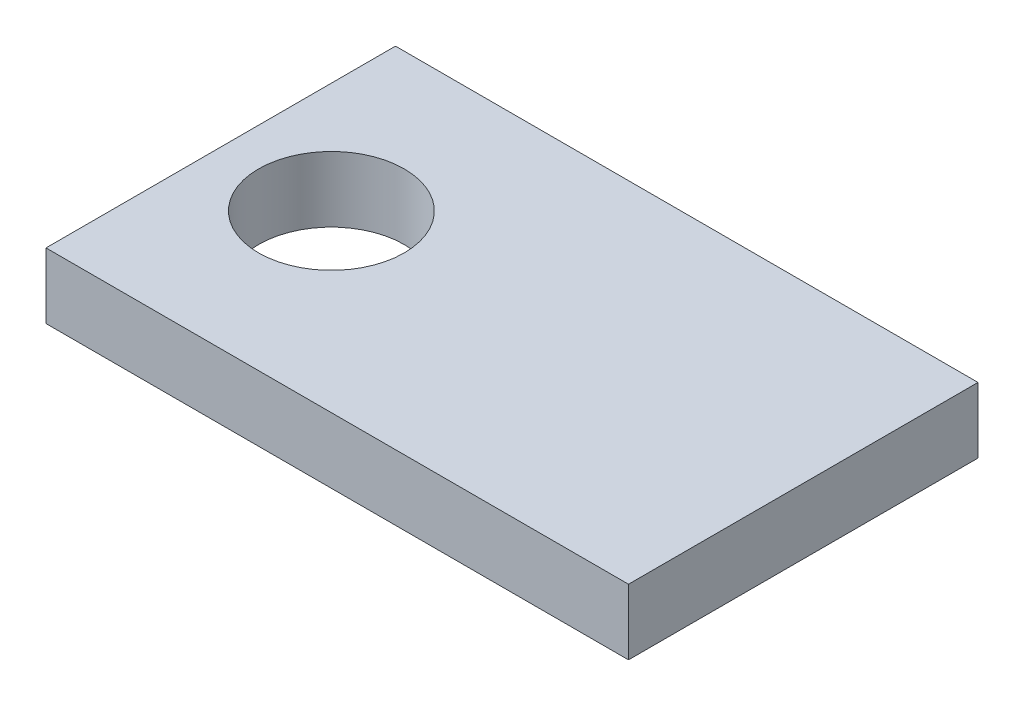
ISO-10303-21;
HEADER;
FILE_DESCRIPTION(('STEP AP214'),'2;1');
FILE_NAME('part.step','',(''),(''),'','','');
FILE_SCHEMA(('AUTOMOTIVE_DESIGN { 1 0 10303 214 1 1 1 1 }'));
ENDSEC;
DATA;
#1=APPLICATION_CONTEXT('core data for automotive mechanical design processes');
#2=APPLICATION_PROTOCOL_DEFINITION('international standard','automotive_design',2000,#1);
#3=PRODUCT_CONTEXT('',#1,'mechanical');
#4=PRODUCT('Part','Part','',(#3));
#5=PRODUCT_RELATED_PRODUCT_CATEGORY('part','',(#4));
#6=PRODUCT_DEFINITION_FORMATION('','',#4);
#7=PRODUCT_DEFINITION_CONTEXT('part definition',#1,'design');
#8=PRODUCT_DEFINITION('design','',#6,#7);
#9=PRODUCT_DEFINITION_SHAPE('','',#8);
#10=(LENGTH_UNIT() NAMED_UNIT(*) SI_UNIT(.MILLI.,.METRE.));
#11=(NAMED_UNIT(*) PLANE_ANGLE_UNIT() SI_UNIT($,.RADIAN.));
#12=(NAMED_UNIT(*) SI_UNIT($,.STERADIAN.) SOLID_ANGLE_UNIT());
#13=UNCERTAINTY_MEASURE_WITH_UNIT(LENGTH_MEASURE(1.E-05),#10,'distance_accuracy_value','');
#14=(GEOMETRIC_REPRESENTATION_CONTEXT(3) GLOBAL_UNCERTAINTY_ASSIGNED_CONTEXT((#13)) GLOBAL_UNIT_ASSIGNED_CONTEXT((#10,
#11,#12)) REPRESENTATION_CONTEXT('',''));
#15=CARTESIAN_POINT('',(0.,0.,0.));
#16=DIRECTION('',(0.,0.,1.));
#17=DIRECTION('',(1.,0.,0.));
#18=AXIS2_PLACEMENT_3D('',#15,#16,#17);
#19=CARTESIAN_POINT('',(56.1594146862626,-10.,14.989335089922));
#20=DIRECTION('',(0.,-1.,0.));
#21=DIRECTION('',(0.,0.,-1.));
#22=AXIS2_PLACEMENT_3D('',#19,#20,#21);
#23=PLANE('',#22);
#24=CARTESIAN_POINT('',(104.958650544286,-10.,14.989335089922));
#25=DIRECTION('',(0.,-1.,0.));
#26=DIRECTION('',(0.,0.,-1.));
#27=AXIS2_PLACEMENT_3D('',#24,#25,#26);
#28=CIRCLE('',#27,5.);
#29=CARTESIAN_POINT('',(104.958650544286,-10.,9.98933508992196));
#30=VERTEX_POINT('',#29);
#31=EDGE_CURVE('E11',#30,#30,#28,.T.);
#32=ORIENTED_EDGE('',*,*,#31,.T.);
#33=EDGE_LOOP('',(#32));
#34=FACE_BOUND('',#33,.T.);
#35=DIRECTION('',(0.,0.,-1.));
#36=VECTOR('',#35,1.);
#37=CARTESIAN_POINT('',(97.3601788282394,-10.,14.989335089922));
#38=LINE('',#37,#36);
#39=CARTESIAN_POINT('',(97.3601788282394,-10.,26.9893350899219));
#40=VERTEX_POINT('',#39);
#41=CARTESIAN_POINT('',(97.3601788282394,-10.,2.98933508992196));
#42=VERTEX_POINT('',#41);
#43=EDGE_CURVE('E45',#40,#42,#38,.T.);
#44=ORIENTED_EDGE('',*,*,#43,.F.);
#45=DIRECTION('',(-1.,0.,0.));
#46=VECTOR('',#45,1.);
#47=CARTESIAN_POINT('',(137.360178828239,-10.,26.9893350899219));
#48=LINE('',#47,#46);
#49=CARTESIAN_POINT('',(137.360178828239,-10.,26.9893350899219));
#50=VERTEX_POINT('',#49);
#51=EDGE_CURVE('E97',#50,#40,#48,.T.);
#52=ORIENTED_EDGE('',*,*,#51,.F.);
#53=DIRECTION('',(0.,0.,-1.));
#54=VECTOR('',#53,1.);
#55=CARTESIAN_POINT('',(137.360178828239,-10.,14.989335089922));
#56=LINE('',#55,#54);
#57=CARTESIAN_POINT('',(137.360178828239,-10.,2.98933508992196));
#58=VERTEX_POINT('',#57);
#59=EDGE_CURVE('E83',#50,#58,#56,.T.);
#60=ORIENTED_EDGE('',*,*,#59,.T.);
#61=DIRECTION('',(1.,0.,0.));
#62=VECTOR('',#61,1.);
#63=CARTESIAN_POINT('',(97.3601788282394,-10.,2.98933508992196));
#64=LINE('',#63,#62);
#65=EDGE_CURVE('E114',#42,#58,#64,.T.);
#66=ORIENTED_EDGE('',*,*,#65,.F.);
#67=EDGE_LOOP('',(#44,#52,#60,#66));
#68=FACE_BOUND('',#67,.T.);
#69=ADVANCED_FACE('F41',(#34,#68),#23,.F.);
#70=CARTESIAN_POINT('',(56.1594146862626,-14.5,14.989335089922));
#71=DIRECTION('',(0.,-1.,0.));
#72=DIRECTION('',(0.,0.,-1.));
#73=AXIS2_PLACEMENT_3D('',#70,#71,#72);
#74=PLANE('',#73);
#75=CARTESIAN_POINT('',(104.958650544286,-14.5,14.989335089922));
#76=DIRECTION('',(0.,-1.,0.));
#77=DIRECTION('',(0.,0.,-1.));
#78=AXIS2_PLACEMENT_3D('',#75,#76,#77);
#79=CIRCLE('',#78,5.);
#80=CARTESIAN_POINT('',(104.958650544286,-14.5,9.98933508992196));
#81=VERTEX_POINT('',#80);
#82=EDGE_CURVE('E51',#81,#81,#79,.T.);
#83=ORIENTED_EDGE('',*,*,#82,.F.);
#84=EDGE_LOOP('',(#83));
#85=FACE_BOUND('',#84,.T.);
#86=DIRECTION('',(0.,0.,-1.));
#87=VECTOR('',#86,1.);
#88=CARTESIAN_POINT('',(137.360178828239,-14.5,14.989335089922));
#89=LINE('',#88,#87);
#90=CARTESIAN_POINT('',(137.360178828239,-14.5,26.9893350899219));
#91=VERTEX_POINT('',#90);
#92=CARTESIAN_POINT('',(137.360178828239,-14.5,2.98933508992196));
#93=VERTEX_POINT('',#92);
#94=EDGE_CURVE('E93',#91,#93,#89,.T.);
#95=ORIENTED_EDGE('',*,*,#94,.F.);
#96=DIRECTION('',(1.,0.,0.));
#97=VECTOR('',#96,1.);
#98=CARTESIAN_POINT('',(97.3601788282394,-14.5,26.9893350899219));
#99=LINE('',#98,#97);
#100=CARTESIAN_POINT('',(97.3601788282394,-14.5,26.9893350899219));
#101=VERTEX_POINT('',#100);
#102=EDGE_CURVE('E106',#101,#91,#99,.T.);
#103=ORIENTED_EDGE('',*,*,#102,.F.);
#104=DIRECTION('',(0.,0.,-1.));
#105=VECTOR('',#104,1.);
#106=CARTESIAN_POINT('',(97.3601788282394,-14.5,14.989335089922));
#107=LINE('',#106,#105);
#108=CARTESIAN_POINT('',(97.3601788282394,-14.5,2.98933508992196));
#109=VERTEX_POINT('',#108);
#110=EDGE_CURVE('E94',#101,#109,#107,.T.);
#111=ORIENTED_EDGE('',*,*,#110,.T.);
#112=DIRECTION('',(-1.,0.,0.));
#113=VECTOR('',#112,1.);
#114=CARTESIAN_POINT('',(137.360178828239,-14.5,2.98933508992196));
#115=LINE('',#114,#113);
#116=EDGE_CURVE('E117',#93,#109,#115,.T.);
#117=ORIENTED_EDGE('',*,*,#116,.F.);
#118=EDGE_LOOP('',(#95,#103,#111,#117));
#119=FACE_BOUND('',#118,.T.);
#120=ADVANCED_FACE('F43',(#85,#119),#74,.T.);
#121=CARTESIAN_POINT('',(104.958650544286,-14.5,14.989335089922));
#122=DIRECTION('',(0.,1.,0.));
#123=DIRECTION('',(0.,0.,1.));
#124=AXIS2_PLACEMENT_3D('',#121,#122,#123);
#125=CYLINDRICAL_SURFACE('',#124,5.);
#126=ORIENTED_EDGE('',*,*,#31,.F.);
#127=EDGE_LOOP('',(#126));
#128=FACE_BOUND('',#127,.T.);
#129=ORIENTED_EDGE('',*,*,#82,.T.);
#130=EDGE_LOOP('',(#129));
#131=FACE_BOUND('',#130,.T.);
#132=ADVANCED_FACE('F135',(#128,#131),#125,.F.);
#133=CARTESIAN_POINT('',(137.360178828239,-14.5,14.989335089922));
#134=DIRECTION('',(1.,0.,0.));
#135=DIRECTION('',(0.,1.,0.));
#136=AXIS2_PLACEMENT_3D('',#133,#134,#135);
#137=PLANE('',#136);
#138=ORIENTED_EDGE('',*,*,#59,.F.);
#139=DIRECTION('',(0.,1.,0.));
#140=VECTOR('',#139,1.);
#141=CARTESIAN_POINT('',(137.360178828239,-14.5,26.9893350899219));
#142=LINE('',#141,#140);
#143=EDGE_CURVE('E87',#91,#50,#142,.T.);
#144=ORIENTED_EDGE('',*,*,#143,.F.);
#145=ORIENTED_EDGE('',*,*,#94,.T.);
#146=DIRECTION('',(0.,-1.,0.));
#147=VECTOR('',#146,1.);
#148=CARTESIAN_POINT('',(137.360178828239,-10.,2.98933508992196));
#149=LINE('',#148,#147);
#150=EDGE_CURVE('E89',#58,#93,#149,.T.);
#151=ORIENTED_EDGE('',*,*,#150,.F.);
#152=EDGE_LOOP('',(#138,#144,#145,#151));
#153=FACE_BOUND('',#152,.T.);
#154=ADVANCED_FACE('F85',(#153),#137,.T.);
#155=CARTESIAN_POINT('',(97.3601788282394,-14.5,14.989335089922));
#156=DIRECTION('',(1.,0.,0.));
#157=DIRECTION('',(0.,1.,0.));
#158=AXIS2_PLACEMENT_3D('',#155,#156,#157);
#159=PLANE('',#158);
#160=ORIENTED_EDGE('',*,*,#43,.T.);
#161=DIRECTION('',(0.,1.,0.));
#162=VECTOR('',#161,1.);
#163=CARTESIAN_POINT('',(97.3601788282394,-14.5,2.98933508992196));
#164=LINE('',#163,#162);
#165=EDGE_CURVE('E111',#109,#42,#164,.T.);
#166=ORIENTED_EDGE('',*,*,#165,.F.);
#167=ORIENTED_EDGE('',*,*,#110,.F.);
#168=DIRECTION('',(0.,-1.,0.));
#169=VECTOR('',#168,1.);
#170=CARTESIAN_POINT('',(97.3601788282394,-10.,26.9893350899219));
#171=LINE('',#170,#169);
#172=EDGE_CURVE('E101',#40,#101,#171,.T.);
#173=ORIENTED_EDGE('',*,*,#172,.F.);
#174=EDGE_LOOP('',(#160,#166,#167,#173));
#175=FACE_BOUND('',#174,.T.);
#176=ADVANCED_FACE('F127',(#175),#159,.F.);
#177=CARTESIAN_POINT('',(0.,0.,2.98933508992196));
#178=DIRECTION('',(0.,0.,-1.));
#179=DIRECTION('',(-1.,0.,0.));
#180=AXIS2_PLACEMENT_3D('',#177,#178,#179);
#181=PLANE('',#180);
#182=ORIENTED_EDGE('',*,*,#165,.T.);
#183=ORIENTED_EDGE('',*,*,#65,.T.);
#184=ORIENTED_EDGE('',*,*,#150,.T.);
#185=ORIENTED_EDGE('',*,*,#116,.T.);
#186=EDGE_LOOP('',(#182,#183,#184,#185));
#187=FACE_BOUND('',#186,.T.);
#188=ADVANCED_FACE('F124',(#187),#181,.T.);
#189=CARTESIAN_POINT('',(0.,0.,26.9893350899219));
#190=DIRECTION('',(0.,0.,1.));
#191=DIRECTION('',(1.,0.,0.));
#192=AXIS2_PLACEMENT_3D('',#189,#190,#191);
#193=PLANE('',#192);
#194=ORIENTED_EDGE('',*,*,#143,.T.);
#195=ORIENTED_EDGE('',*,*,#51,.T.);
#196=ORIENTED_EDGE('',*,*,#172,.T.);
#197=ORIENTED_EDGE('',*,*,#102,.T.);
#198=EDGE_LOOP('',(#194,#195,#196,#197));
#199=FACE_BOUND('',#198,.T.);
#200=ADVANCED_FACE('F104',(#199),#193,.T.);
#201=CLOSED_SHELL('',(#69,#120,#132,#154,#176,#188,#200));
#202=MANIFOLD_SOLID_BREP('B2',#201);
#203=ADVANCED_BREP_SHAPE_REPRESENTATION('',(#18,#202),#14);
#204=SHAPE_DEFINITION_REPRESENTATION(#9,#203);
ENDSEC;
END-ISO-10303-21;
